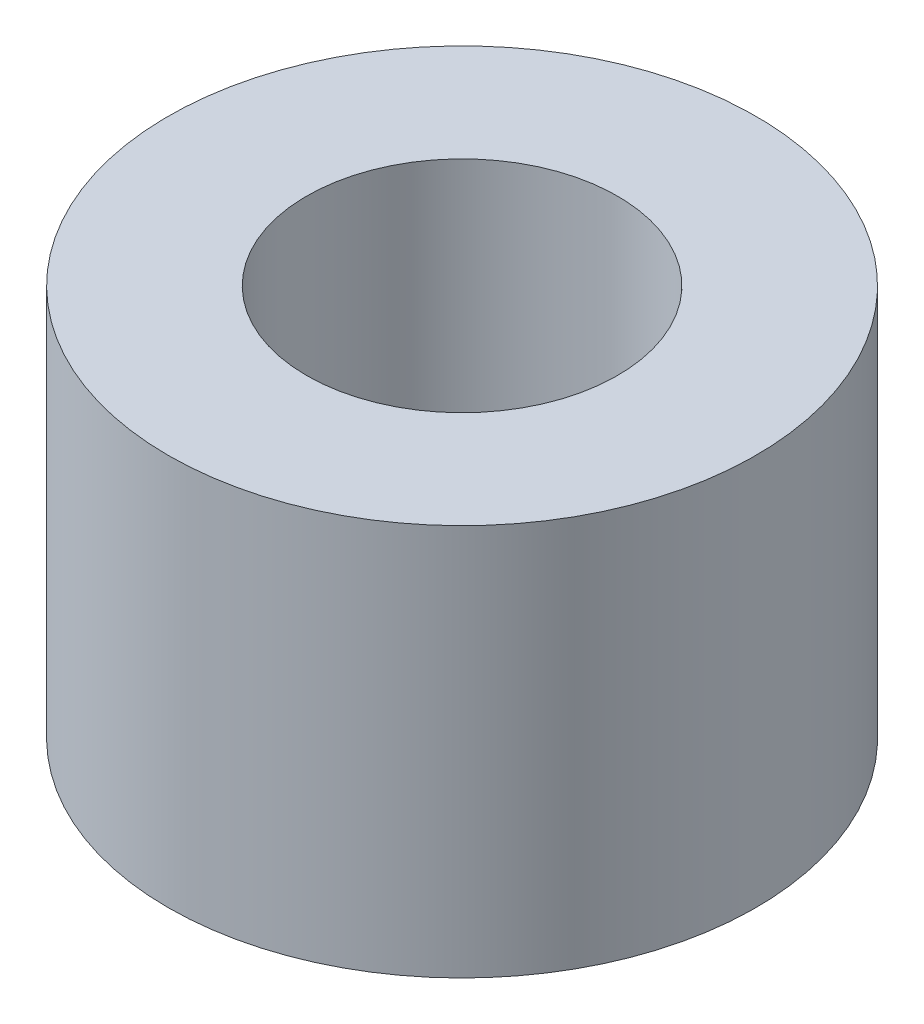
ISO-10303-21;
HEADER;
FILE_DESCRIPTION(('STEP AP214'),'2;1');
FILE_NAME('part.step','',(''),(''),'','','');
FILE_SCHEMA(('AUTOMOTIVE_DESIGN { 1 0 10303 214 1 1 1 1 }'));
ENDSEC;
DATA;
#1=APPLICATION_CONTEXT('core data for automotive mechanical design processes');
#2=APPLICATION_PROTOCOL_DEFINITION('international standard','automotive_design',2000,#1);
#3=PRODUCT_CONTEXT('',#1,'mechanical');
#4=PRODUCT('Part','Part','',(#3));
#5=PRODUCT_RELATED_PRODUCT_CATEGORY('part','',(#4));
#6=PRODUCT_DEFINITION_FORMATION('','',#4);
#7=PRODUCT_DEFINITION_CONTEXT('part definition',#1,'design');
#8=PRODUCT_DEFINITION('design','',#6,#7);
#9=PRODUCT_DEFINITION_SHAPE('','',#8);
#10=(LENGTH_UNIT() NAMED_UNIT(*) SI_UNIT(.MILLI.,.METRE.));
#11=(NAMED_UNIT(*) PLANE_ANGLE_UNIT() SI_UNIT($,.RADIAN.));
#12=(NAMED_UNIT(*) SI_UNIT($,.STERADIAN.) SOLID_ANGLE_UNIT());
#13=UNCERTAINTY_MEASURE_WITH_UNIT(LENGTH_MEASURE(1.E-05),#10,'distance_accuracy_value','');
#14=(GEOMETRIC_REPRESENTATION_CONTEXT(3) GLOBAL_UNCERTAINTY_ASSIGNED_CONTEXT((#13)) GLOBAL_UNIT_ASSIGNED_CONTEXT((#10,
#11,#12)) REPRESENTATION_CONTEXT('',''));
#15=CARTESIAN_POINT('',(0.,0.,0.));
#16=DIRECTION('',(0.,0.,1.));
#17=DIRECTION('',(1.,0.,0.));
#18=AXIS2_PLACEMENT_3D('',#15,#16,#17);
#19=CARTESIAN_POINT('',(0.,12.,0.));
#20=DIRECTION('',(0.,1.,0.));
#21=DIRECTION('',(0.,0.,1.));
#22=AXIS2_PLACEMENT_3D('',#19,#20,#21);
#23=PLANE('',#22);
#24=CARTESIAN_POINT('',(0.,12.,0.));
#25=DIRECTION('',(0.,1.,0.));
#26=DIRECTION('',(0.,0.,1.));
#27=AXIS2_PLACEMENT_3D('',#24,#25,#26);
#28=CIRCLE('',#27,9.);
#29=CARTESIAN_POINT('',(0.,12.,9.));
#30=VERTEX_POINT('',#29);
#31=EDGE_CURVE('E10',#30,#30,#28,.T.);
#32=ORIENTED_EDGE('',*,*,#31,.T.);
#33=EDGE_LOOP('',(#32));
#34=FACE_BOUND('',#33,.T.);
#35=CARTESIAN_POINT('',(0.,12.,0.));
#36=DIRECTION('',(0.,1.,0.));
#37=DIRECTION('',(0.,0.,1.));
#38=AXIS2_PLACEMENT_3D('',#35,#36,#37);
#39=CIRCLE('',#38,4.7625);
#40=CARTESIAN_POINT('',(0.,12.,4.7625));
#41=VERTEX_POINT('',#40);
#42=EDGE_CURVE('E48',#41,#41,#39,.T.);
#43=ORIENTED_EDGE('',*,*,#42,.F.);
#44=EDGE_LOOP('',(#43));
#45=FACE_BOUND('',#44,.T.);
#46=ADVANCED_FACE('F37',(#34,#45),#23,.T.);
#47=CARTESIAN_POINT('',(0.,0.,0.));
#48=DIRECTION('',(0.,1.,0.));
#49=DIRECTION('',(0.,0.,1.));
#50=AXIS2_PLACEMENT_3D('',#47,#48,#49);
#51=PLANE('',#50);
#52=CARTESIAN_POINT('',(0.,0.,0.));
#53=DIRECTION('',(0.,1.,0.));
#54=DIRECTION('',(0.,0.,1.));
#55=AXIS2_PLACEMENT_3D('',#52,#53,#54);
#56=CIRCLE('',#55,9.);
#57=CARTESIAN_POINT('',(0.,0.,9.));
#58=VERTEX_POINT('',#57);
#59=EDGE_CURVE('E41',#58,#58,#56,.T.);
#60=ORIENTED_EDGE('',*,*,#59,.F.);
#61=EDGE_LOOP('',(#60));
#62=FACE_BOUND('',#61,.T.);
#63=CARTESIAN_POINT('',(0.,0.,0.));
#64=DIRECTION('',(0.,1.,0.));
#65=DIRECTION('',(0.,0.,1.));
#66=AXIS2_PLACEMENT_3D('',#63,#64,#65);
#67=CIRCLE('',#66,4.7625);
#68=CARTESIAN_POINT('',(0.,0.,4.7625));
#69=VERTEX_POINT('',#68);
#70=EDGE_CURVE('E50',#69,#69,#67,.T.);
#71=ORIENTED_EDGE('',*,*,#70,.T.);
#72=EDGE_LOOP('',(#71));
#73=FACE_BOUND('',#72,.T.);
#74=ADVANCED_FACE('F60',(#62,#73),#51,.F.);
#75=CARTESIAN_POINT('',(0.,12.,0.));
#76=DIRECTION('',(0.,-1.,0.));
#77=DIRECTION('',(0.,0.,-1.));
#78=AXIS2_PLACEMENT_3D('',#75,#76,#77);
#79=CYLINDRICAL_SURFACE('',#78,9.);
#80=ORIENTED_EDGE('',*,*,#31,.F.);
#81=EDGE_LOOP('',(#80));
#82=FACE_BOUND('',#81,.T.);
#83=ORIENTED_EDGE('',*,*,#59,.T.);
#84=EDGE_LOOP('',(#83));
#85=FACE_BOUND('',#84,.T.);
#86=ADVANCED_FACE('F39',(#82,#85),#79,.T.);
#87=CARTESIAN_POINT('',(0.,12.,0.));
#88=DIRECTION('',(0.,-1.,0.));
#89=DIRECTION('',(0.,0.,-1.));
#90=AXIS2_PLACEMENT_3D('',#87,#88,#89);
#91=CYLINDRICAL_SURFACE('',#90,4.7625);
#92=ORIENTED_EDGE('',*,*,#42,.T.);
#93=EDGE_LOOP('',(#92));
#94=FACE_BOUND('',#93,.T.);
#95=ORIENTED_EDGE('',*,*,#70,.F.);
#96=EDGE_LOOP('',(#95));
#97=FACE_BOUND('',#96,.T.);
#98=ADVANCED_FACE('F56',(#94,#97),#91,.F.);
#99=CLOSED_SHELL('',(#46,#74,#86,#98));
#100=MANIFOLD_SOLID_BREP('B2',#99);
#101=ADVANCED_BREP_SHAPE_REPRESENTATION('',(#18,#100),#14);
#102=SHAPE_DEFINITION_REPRESENTATION(#9,#101);
ENDSEC;
END-ISO-10303-21;
